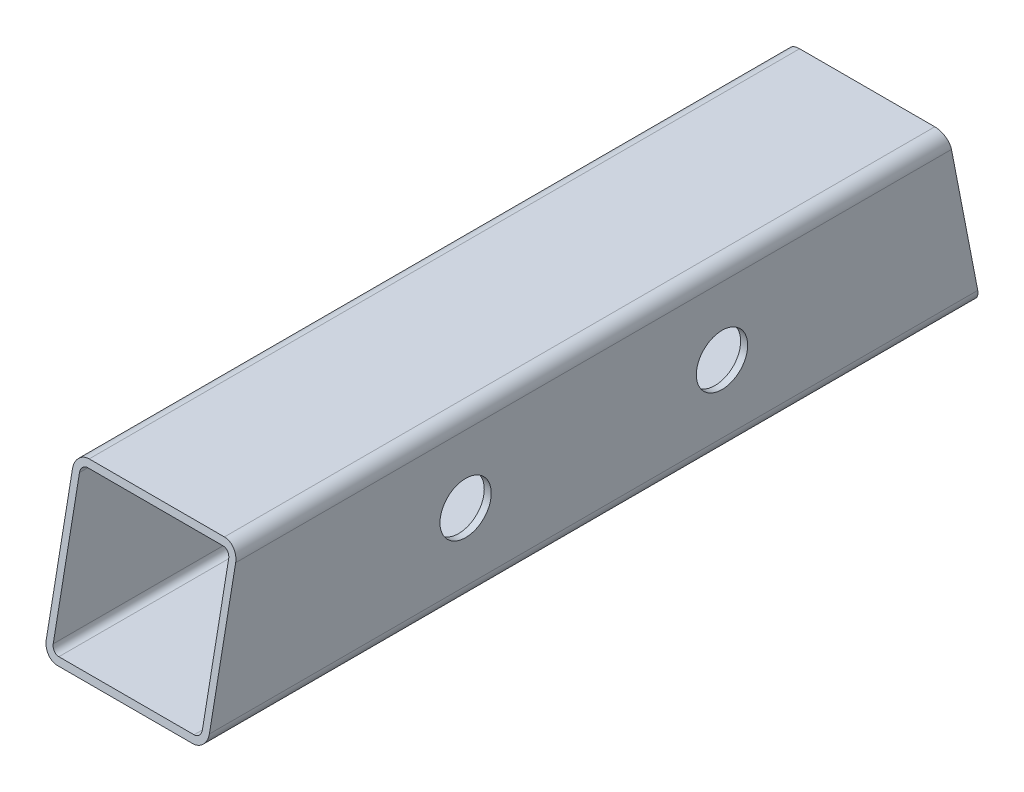
ISO-10303-21;
HEADER;
FILE_DESCRIPTION(('STEP AP214'),'2;1');
FILE_NAME('part.step','',(''),(''),'','','');
FILE_SCHEMA(('AUTOMOTIVE_DESIGN { 1 0 10303 214 1 1 1 1 }'));
ENDSEC;
DATA;
#1=APPLICATION_CONTEXT('core data for automotive mechanical design processes');
#2=APPLICATION_PROTOCOL_DEFINITION('international standard','automotive_design',2000,#1);
#3=PRODUCT_CONTEXT('',#1,'mechanical');
#4=PRODUCT('Part','Part','',(#3));
#5=PRODUCT_RELATED_PRODUCT_CATEGORY('part','',(#4));
#6=PRODUCT_DEFINITION_FORMATION('','',#4);
#7=PRODUCT_DEFINITION_CONTEXT('part definition',#1,'design');
#8=PRODUCT_DEFINITION('design','',#6,#7);
#9=PRODUCT_DEFINITION_SHAPE('','',#8);
#10=(LENGTH_UNIT() NAMED_UNIT(*) SI_UNIT(.MILLI.,.METRE.));
#11=(NAMED_UNIT(*) PLANE_ANGLE_UNIT() SI_UNIT($,.RADIAN.));
#12=(NAMED_UNIT(*) SI_UNIT($,.STERADIAN.) SOLID_ANGLE_UNIT());
#13=UNCERTAINTY_MEASURE_WITH_UNIT(LENGTH_MEASURE(1.E-05),#10,'distance_accuracy_value','');
#14=(GEOMETRIC_REPRESENTATION_CONTEXT(3) GLOBAL_UNCERTAINTY_ASSIGNED_CONTEXT((#13)) GLOBAL_UNIT_ASSIGNED_CONTEXT((#10,
#11,#12)) REPRESENTATION_CONTEXT('',''));
#15=CARTESIAN_POINT('',(0.,0.,0.));
#16=DIRECTION('',(0.,0.,1.));
#17=DIRECTION('',(1.,0.,0.));
#18=AXIS2_PLACEMENT_3D('',#15,#16,#17);
#19=CARTESIAN_POINT('',(22.4792899408284,23.5118343195266,332.));
#20=DIRECTION('',(0.,0.,-1.));
#21=DIRECTION('',(-1.,0.,0.));
#22=AXIS2_PLACEMENT_3D('',#19,#20,#21);
#23=CYLINDRICAL_SURFACE('',#22,6.);
#24=CARTESIAN_POINT('',(22.4792899408284,23.5118343195266,319.565714285714));
#25=DIRECTION('',(0.,0.190719516860693,0.981644572077096));
#26=DIRECTION('',(0.,0.981644572077096,-0.190719516860693));
#27=AXIS2_PLACEMENT_3D('',#24,#25,#26);
#28=ELLIPSE('',#27,6.11219189783161,6.);
#29=CARTESIAN_POINT('',(28.4792899408284,23.5118343195266,319.565714285714));
#30=VERTEX_POINT('',#29);
#31=CARTESIAN_POINT('',(22.4792899408284,29.5118343195266,318.4));
#32=VERTEX_POINT('',#31);
#33=EDGE_CURVE('E196',#30,#32,#28,.T.);
#34=ORIENTED_EDGE('',*,*,#33,.F.);
#35=DIRECTION('',(0.,0.,-1.));
#36=VECTOR('',#35,1.);
#37=CARTESIAN_POINT('',(28.4792899408284,23.5118343195266,332.));
#38=LINE('',#37,#36);
#39=CARTESIAN_POINT('',(28.4792899408284,23.5118343195266,12.4342857142857));
#40=VERTEX_POINT('',#39);
#41=EDGE_CURVE('E100',#30,#40,#38,.T.);
#42=ORIENTED_EDGE('',*,*,#41,.T.);
#43=CARTESIAN_POINT('',(22.4792899408284,23.5118343195266,12.4342857142857));
#44=DIRECTION('',(0.,0.190719516860693,-0.981644572077096));
#45=DIRECTION('',(0.,-0.981644572077096,-0.190719516860693));
#46=AXIS2_PLACEMENT_3D('',#43,#44,#45);
#47=ELLIPSE('',#46,6.11219189783161,6.);
#48=CARTESIAN_POINT('',(22.4792899408284,29.5118343195266,13.6));
#49=VERTEX_POINT('',#48);
#50=EDGE_CURVE('E309',#49,#40,#47,.T.);
#51=ORIENTED_EDGE('',*,*,#50,.F.);
#52=DIRECTION('',(0.,0.,-1.));
#53=VECTOR('',#52,1.);
#54=CARTESIAN_POINT('',(22.4792899408284,29.5118343195266,332.));
#55=LINE('',#54,#53);
#56=EDGE_CURVE('E84',#32,#49,#55,.T.);
#57=ORIENTED_EDGE('',*,*,#56,.F.);
#58=EDGE_LOOP('',(#34,#42,#51,#57));
#59=FACE_BOUND('',#58,.T.);
#60=ADVANCED_FACE('F76',(#59),#23,.T.);
#61=CARTESIAN_POINT('',(22.4792899408284,29.5118343195266,332.));
#62=DIRECTION('',(0.,-1.,0.));
#63=DIRECTION('',(1.,0.,0.));
#64=AXIS2_PLACEMENT_3D('',#61,#62,#63);
#65=PLANE('',#64);
#66=DIRECTION('',(1.,0.,0.));
#67=VECTOR('',#66,1.);
#68=CARTESIAN_POINT('',(-301.520710059172,29.5118343195266,318.4));
#69=LINE('',#68,#67);
#70=CARTESIAN_POINT('',(-35.5207100591716,29.5118343195266,318.4));
#71=VERTEX_POINT('',#70);
#72=EDGE_CURVE('E191',#71,#32,#69,.T.);
#73=ORIENTED_EDGE('',*,*,#72,.T.);
#74=ORIENTED_EDGE('',*,*,#56,.T.);
#75=DIRECTION('',(1.,0.,0.));
#76=VECTOR('',#75,1.);
#77=CARTESIAN_POINT('',(-301.520710059172,29.5118343195266,13.6));
#78=LINE('',#77,#76);
#79=CARTESIAN_POINT('',(-35.5207100591716,29.5118343195266,13.6));
#80=VERTEX_POINT('',#79);
#81=EDGE_CURVE('E215',#80,#49,#78,.T.);
#82=ORIENTED_EDGE('',*,*,#81,.F.);
#83=DIRECTION('',(0.,0.,-1.));
#84=VECTOR('',#83,1.);
#85=CARTESIAN_POINT('',(-35.5207100591716,29.5118343195266,332.));
#86=LINE('',#85,#84);
#87=EDGE_CURVE('E207',#71,#80,#86,.T.);
#88=ORIENTED_EDGE('',*,*,#87,.F.);
#89=EDGE_LOOP('',(#73,#74,#82,#88));
#90=FACE_BOUND('',#89,.T.);
#91=ADVANCED_FACE('F213',(#90),#65,.F.);
#92=CARTESIAN_POINT('',(-35.5207100591716,23.5118343195266,332.));
#93=DIRECTION('',(0.,0.,-1.));
#94=DIRECTION('',(-1.,0.,0.));
#95=AXIS2_PLACEMENT_3D('',#92,#93,#94);
#96=CYLINDRICAL_SURFACE('',#95,6.);
#97=CARTESIAN_POINT('',(-35.5207100591716,23.5118343195266,319.565714285714));
#98=DIRECTION('',(0.,0.190719516860693,0.981644572077096));
#99=DIRECTION('',(0.,0.981644572077096,-0.190719516860693));
#100=AXIS2_PLACEMENT_3D('',#97,#98,#99);
#101=ELLIPSE('',#100,6.11219189783161,6.);
#102=CARTESIAN_POINT('',(-41.5207100591716,23.5118343195266,319.565714285714));
#103=VERTEX_POINT('',#102);
#104=EDGE_CURVE('E194',#71,#103,#101,.T.);
#105=ORIENTED_EDGE('',*,*,#104,.F.);
#106=ORIENTED_EDGE('',*,*,#87,.T.);
#107=CARTESIAN_POINT('',(-35.5207100591716,23.5118343195266,12.4342857142857));
#108=DIRECTION('',(0.,0.190719516860693,-0.981644572077096));
#109=DIRECTION('',(0.,-0.981644572077096,-0.190719516860693));
#110=AXIS2_PLACEMENT_3D('',#107,#108,#109);
#111=ELLIPSE('',#110,6.11219189783161,6.);
#112=CARTESIAN_POINT('',(-41.5207100591716,23.5118343195266,12.4342857142857));
#113=VERTEX_POINT('',#112);
#114=EDGE_CURVE('E307',#113,#80,#111,.T.);
#115=ORIENTED_EDGE('',*,*,#114,.F.);
#116=DIRECTION('',(0.,0.,-1.));
#117=VECTOR('',#116,1.);
#118=CARTESIAN_POINT('',(-41.5207100591716,23.5118343195266,332.));
#119=LINE('',#118,#117);
#120=EDGE_CURVE('E209',#103,#113,#119,.T.);
#121=ORIENTED_EDGE('',*,*,#120,.F.);
#122=EDGE_LOOP('',(#105,#106,#115,#121));
#123=FACE_BOUND('',#122,.T.);
#124=ADVANCED_FACE('F205',(#123),#96,.T.);
#125=CARTESIAN_POINT('',(-41.5207100591716,23.5118343195266,332.));
#126=DIRECTION('',(1.,0.,0.));
#127=DIRECTION('',(0.,1.,0.));
#128=AXIS2_PLACEMENT_3D('',#125,#126,#127);
#129=PLANE('',#128);
#130=CARTESIAN_POINT('',(-41.5207100591716,-5.48816568047335,110.9));
#131=DIRECTION('',(1.,0.,0.));
#132=DIRECTION('',(0.,1.,0.));
#133=AXIS2_PLACEMENT_3D('',#130,#131,#132);
#134=CIRCLE('',#133,7.5);
#135=CARTESIAN_POINT('',(-41.5207100591716,2.01183431952665,110.9));
#136=VERTEX_POINT('',#135);
#137=EDGE_CURVE('E271',#136,#136,#134,.T.);
#138=ORIENTED_EDGE('',*,*,#137,.T.);
#139=EDGE_LOOP('',(#138));
#140=FACE_BOUND('',#139,.T.);
#141=CARTESIAN_POINT('',(-41.5207100591716,-5.48816568047337,220.9));
#142=DIRECTION('',(1.,0.,0.));
#143=DIRECTION('',(0.,1.,0.));
#144=AXIS2_PLACEMENT_3D('',#141,#142,#143);
#145=CIRCLE('',#144,7.50000000000001);
#146=CARTESIAN_POINT('',(-41.5207100591716,2.01183431952664,220.9));
#147=VERTEX_POINT('',#146);
#148=EDGE_CURVE('E265',#147,#147,#145,.T.);
#149=ORIENTED_EDGE('',*,*,#148,.T.);
#150=EDGE_LOOP('',(#149));
#151=FACE_BOUND('',#150,.T.);
#152=DIRECTION('',(0.,-0.981644572077096,0.190719516860693));
#153=VECTOR('',#152,1.);
#154=CARTESIAN_POINT('',(-41.5207100591716,21.1839025363857,320.01799817501));
#155=LINE('',#154,#153);
#156=CARTESIAN_POINT('',(-41.5207100591716,-34.4881656804733,330.834285714286));
#157=VERTEX_POINT('',#156);
#158=EDGE_CURVE('E210',#103,#157,#155,.T.);
#159=ORIENTED_EDGE('',*,*,#158,.F.);
#160=ORIENTED_EDGE('',*,*,#120,.T.);
#161=DIRECTION('',(0.,0.981644572077096,0.190719516860693));
#162=VECTOR('',#161,1.);
#163=CARTESIAN_POINT('',(-41.5207100591716,83.3405370035202,24.058147950033));
#164=LINE('',#163,#162);
#165=CARTESIAN_POINT('',(-41.5207100591716,-34.4881656804733,1.16571428571427));
#166=VERTEX_POINT('',#165);
#167=EDGE_CURVE('E304',#166,#113,#164,.T.);
#168=ORIENTED_EDGE('',*,*,#167,.F.);
#169=DIRECTION('',(0.,0.,-1.));
#170=VECTOR('',#169,1.);
#171=CARTESIAN_POINT('',(-41.5207100591716,-34.4881656804733,332.));
#172=LINE('',#171,#170);
#173=EDGE_CURVE('E218',#157,#166,#172,.T.);
#174=ORIENTED_EDGE('',*,*,#173,.F.);
#175=EDGE_LOOP('',(#159,#160,#168,#174));
#176=FACE_BOUND('',#175,.T.);
#177=ADVANCED_FACE('F350',(#140,#151,#176),#129,.F.);
#178=CARTESIAN_POINT('',(-35.5207100591716,-34.4881656804734,332.));
#179=DIRECTION('',(0.,0.,-1.));
#180=DIRECTION('',(-1.,0.,0.));
#181=AXIS2_PLACEMENT_3D('',#178,#179,#180);
#182=CYLINDRICAL_SURFACE('',#181,6.);
#183=CARTESIAN_POINT('',(-35.5207100591716,-34.4881656804734,330.834285714286));
#184=DIRECTION('',(0.,0.190719516860693,0.981644572077096));
#185=DIRECTION('',(0.,0.981644572077096,-0.190719516860693));
#186=AXIS2_PLACEMENT_3D('',#183,#184,#185);
#187=ELLIPSE('',#186,6.11219189783161,6.);
#188=CARTESIAN_POINT('',(-35.5207100591715,-40.4881656804734,332.));
#189=VERTEX_POINT('',#188);
#190=EDGE_CURVE('E258',#157,#189,#187,.T.);
#191=ORIENTED_EDGE('',*,*,#190,.F.);
#192=ORIENTED_EDGE('',*,*,#173,.T.);
#193=CARTESIAN_POINT('',(-35.5207100591716,-34.4881656804734,1.16571428571427));
#194=DIRECTION('',(0.,0.190719516860693,-0.981644572077096));
#195=DIRECTION('',(0.,-0.981644572077096,-0.190719516860693));
#196=AXIS2_PLACEMENT_3D('',#193,#194,#195);
#197=ELLIPSE('',#196,6.11219189783161,6.);
#198=CARTESIAN_POINT('',(-35.5207100591716,-40.4881656804734,0.));
#199=VERTEX_POINT('',#198);
#200=EDGE_CURVE('E301',#199,#166,#197,.T.);
#201=ORIENTED_EDGE('',*,*,#200,.F.);
#202=DIRECTION('',(0.,0.,-1.));
#203=VECTOR('',#202,1.);
#204=CARTESIAN_POINT('',(-35.5207100591715,-40.4881656804734,332.));
#205=LINE('',#204,#203);
#206=EDGE_CURVE('E338',#189,#199,#205,.T.);
#207=ORIENTED_EDGE('',*,*,#206,.F.);
#208=EDGE_LOOP('',(#191,#192,#201,#207));
#209=FACE_BOUND('',#208,.T.);
#210=ADVANCED_FACE('F344',(#209),#182,.T.);
#211=CARTESIAN_POINT('',(22.4792899408284,-34.4881656804734,332.));
#212=DIRECTION('',(0.,0.,-1.));
#213=DIRECTION('',(-1.,0.,0.));
#214=AXIS2_PLACEMENT_3D('',#211,#212,#213);
#215=CYLINDRICAL_SURFACE('',#214,6.);
#216=CARTESIAN_POINT('',(22.4792899408284,-34.4881656804734,330.834285714286));
#217=DIRECTION('',(0.,0.190719516860693,0.981644572077096));
#218=DIRECTION('',(0.,0.981644572077096,-0.190719516860693));
#219=AXIS2_PLACEMENT_3D('',#216,#217,#218);
#220=ELLIPSE('',#219,6.11219189783161,6.);
#221=CARTESIAN_POINT('',(22.4792899408284,-40.4881656804734,332.));
#222=VERTEX_POINT('',#221);
#223=CARTESIAN_POINT('',(28.4792899408284,-34.4881656804734,330.834285714286));
#224=VERTEX_POINT('',#223);
#225=EDGE_CURVE('E256',#222,#224,#220,.T.);
#226=ORIENTED_EDGE('',*,*,#225,.F.);
#227=DIRECTION('',(0.,0.,-1.));
#228=VECTOR('',#227,1.);
#229=CARTESIAN_POINT('',(22.4792899408284,-40.4881656804734,332.));
#230=LINE('',#229,#228);
#231=CARTESIAN_POINT('',(22.4792899408284,-40.4881656804734,0.));
#232=VERTEX_POINT('',#231);
#233=EDGE_CURVE('E335',#222,#232,#230,.T.);
#234=ORIENTED_EDGE('',*,*,#233,.T.);
#235=CARTESIAN_POINT('',(22.4792899408284,-34.4881656804734,1.16571428571427));
#236=DIRECTION('',(0.,0.190719516860693,-0.981644572077096));
#237=DIRECTION('',(0.,-0.981644572077096,-0.190719516860693));
#238=AXIS2_PLACEMENT_3D('',#235,#236,#237);
#239=ELLIPSE('',#238,6.11219189783161,6.);
#240=CARTESIAN_POINT('',(28.4792899408284,-34.4881656804733,1.16571428571429));
#241=VERTEX_POINT('',#240);
#242=EDGE_CURVE('E299',#241,#232,#239,.T.);
#243=ORIENTED_EDGE('',*,*,#242,.F.);
#244=DIRECTION('',(0.,0.,-1.));
#245=VECTOR('',#244,1.);
#246=CARTESIAN_POINT('',(28.4792899408284,-34.4881656804733,332.));
#247=LINE('',#246,#245);
#248=EDGE_CURVE('E333',#224,#241,#247,.T.);
#249=ORIENTED_EDGE('',*,*,#248,.F.);
#250=EDGE_LOOP('',(#226,#234,#243,#249));
#251=FACE_BOUND('',#250,.T.);
#252=ADVANCED_FACE('F358',(#251),#215,.T.);
#253=CARTESIAN_POINT('',(28.4792899408284,23.5118343195266,332.));
#254=DIRECTION('',(-1.,0.,0.));
#255=DIRECTION('',(0.,-1.,0.));
#256=AXIS2_PLACEMENT_3D('',#253,#254,#255);
#257=PLANE('',#256);
#258=CARTESIAN_POINT('',(28.4792899408284,-5.48816568047334,110.9));
#259=DIRECTION('',(1.,0.,0.));
#260=DIRECTION('',(0.,1.,0.));
#261=AXIS2_PLACEMENT_3D('',#258,#259,#260);
#262=CIRCLE('',#261,11.);
#263=CARTESIAN_POINT('',(28.4792899408284,5.51183431952665,110.9));
#264=VERTEX_POINT('',#263);
#265=EDGE_CURVE('E230',#264,#264,#262,.T.);
#266=ORIENTED_EDGE('',*,*,#265,.F.);
#267=EDGE_LOOP('',(#266));
#268=FACE_BOUND('',#267,.T.);
#269=CARTESIAN_POINT('',(28.4792899408284,-5.48816568047337,220.9));
#270=DIRECTION('',(1.,0.,0.));
#271=DIRECTION('',(0.,1.,0.));
#272=AXIS2_PLACEMENT_3D('',#269,#270,#271);
#273=CIRCLE('',#272,11.);
#274=CARTESIAN_POINT('',(28.4792899408284,5.51183431952664,220.9));
#275=VERTEX_POINT('',#274);
#276=EDGE_CURVE('E222',#275,#275,#273,.T.);
#277=ORIENTED_EDGE('',*,*,#276,.F.);
#278=EDGE_LOOP('',(#277));
#279=FACE_BOUND('',#278,.T.);
#280=DIRECTION('',(0.,-0.981644572077096,0.190719516860693));
#281=VECTOR('',#280,1.);
#282=CARTESIAN_POINT('',(28.4792899408284,29.5118343195266,318.4));
#283=LINE('',#282,#281);
#284=EDGE_CURVE('E200',#30,#224,#283,.T.);
#285=ORIENTED_EDGE('',*,*,#284,.T.);
#286=ORIENTED_EDGE('',*,*,#248,.T.);
#287=DIRECTION('',(0.,0.981644572077096,0.190719516860693));
#288=VECTOR('',#287,1.);
#289=CARTESIAN_POINT('',(28.4792899408284,-1.47271387076011,7.58014492303));
#290=LINE('',#289,#288);
#291=EDGE_CURVE('E274',#241,#40,#290,.T.);
#292=ORIENTED_EDGE('',*,*,#291,.T.);
#293=ORIENTED_EDGE('',*,*,#41,.F.);
#294=EDGE_LOOP('',(#285,#286,#292,#293));
#295=FACE_BOUND('',#294,.T.);
#296=ADVANCED_FACE('F361',(#268,#279,#295),#257,.F.);
#297=CARTESIAN_POINT('',(22.4792899408284,23.5118343195266,332.));
#298=DIRECTION('',(0.,0.,-1.));
#299=DIRECTION('',(-1.,0.,0.));
#300=AXIS2_PLACEMENT_3D('',#297,#298,#299);
#301=CYLINDRICAL_SURFACE('',#300,3.);
#302=DIRECTION('',(0.,0.,-1.));
#303=VECTOR('',#302,1.);
#304=CARTESIAN_POINT('',(25.4792899408284,23.5118343195266,332.));
#305=LINE('',#304,#303);
#306=CARTESIAN_POINT('',(25.4792899408284,23.5118343195266,319.565714285714));
#307=VERTEX_POINT('',#306);
#308=CARTESIAN_POINT('',(25.4792899408284,23.5118343195266,12.4342857142857));
#309=VERTEX_POINT('',#308);
#310=EDGE_CURVE('E311',#307,#309,#305,.T.);
#311=ORIENTED_EDGE('',*,*,#310,.F.);
#312=CARTESIAN_POINT('',(22.4792899408284,23.5118343195266,319.565714285714));
#313=DIRECTION('',(0.,0.190719516860693,0.981644572077096));
#314=DIRECTION('',(0.,0.981644572077096,-0.190719516860693));
#315=AXIS2_PLACEMENT_3D('',#312,#313,#314);
#316=ELLIPSE('',#315,3.0560959489158,3.);
#317=CARTESIAN_POINT('',(22.4792899408284,26.5118343195266,318.982857142857));
#318=VERTEX_POINT('',#317);
#319=EDGE_CURVE('E92',#307,#318,#316,.T.);
#320=ORIENTED_EDGE('',*,*,#319,.T.);
#321=DIRECTION('',(0.,0.,-1.));
#322=VECTOR('',#321,1.);
#323=CARTESIAN_POINT('',(22.4792899408284,26.5118343195266,332.));
#324=LINE('',#323,#322);
#325=CARTESIAN_POINT('',(22.4792899408284,26.5118343195266,13.0171428571428));
#326=VERTEX_POINT('',#325);
#327=EDGE_CURVE('E325',#318,#326,#324,.T.);
#328=ORIENTED_EDGE('',*,*,#327,.T.);
#329=CARTESIAN_POINT('',(22.4792899408284,23.5118343195266,12.4342857142857));
#330=DIRECTION('',(0.,0.190719516860693,-0.981644572077096));
#331=DIRECTION('',(0.,-0.981644572077096,-0.190719516860693));
#332=AXIS2_PLACEMENT_3D('',#329,#330,#331);
#333=ELLIPSE('',#332,3.0560959489158,3.);
#334=EDGE_CURVE('E296',#326,#309,#333,.T.);
#335=ORIENTED_EDGE('',*,*,#334,.T.);
#336=EDGE_LOOP('',(#311,#320,#328,#335));
#337=FACE_BOUND('',#336,.T.);
#338=ADVANCED_FACE('F384',(#337),#301,.F.);
#339=CARTESIAN_POINT('',(22.4792899408284,26.5118343195266,332.));
#340=DIRECTION('',(0.,-1.,0.));
#341=DIRECTION('',(1.,0.,0.));
#342=AXIS2_PLACEMENT_3D('',#339,#340,#341);
#343=PLANE('',#342);
#344=ORIENTED_EDGE('',*,*,#327,.F.);
#345=DIRECTION('',(-1.,0.,0.));
#346=VECTOR('',#345,1.);
#347=CARTESIAN_POINT('',(22.4792899408284,26.5118343195266,318.982857142857));
#348=LINE('',#347,#346);
#349=CARTESIAN_POINT('',(-35.5207100591716,26.5118343195266,318.982857142857));
#350=VERTEX_POINT('',#349);
#351=EDGE_CURVE('E252',#318,#350,#348,.T.);
#352=ORIENTED_EDGE('',*,*,#351,.T.);
#353=DIRECTION('',(0.,0.,-1.));
#354=VECTOR('',#353,1.);
#355=CARTESIAN_POINT('',(-35.5207100591716,26.5118343195266,332.));
#356=LINE('',#355,#354);
#357=CARTESIAN_POINT('',(-35.5207100591716,26.5118343195266,13.0171428571428));
#358=VERTEX_POINT('',#357);
#359=EDGE_CURVE('E323',#350,#358,#356,.T.);
#360=ORIENTED_EDGE('',*,*,#359,.T.);
#361=DIRECTION('',(1.,0.,0.));
#362=VECTOR('',#361,1.);
#363=CARTESIAN_POINT('',(22.4792899408284,26.5118343195266,13.0171428571428));
#364=LINE('',#363,#362);
#365=EDGE_CURVE('E293',#358,#326,#364,.T.);
#366=ORIENTED_EDGE('',*,*,#365,.T.);
#367=EDGE_LOOP('',(#344,#352,#360,#366));
#368=FACE_BOUND('',#367,.T.);
#369=ADVANCED_FACE('F388',(#368),#343,.T.);
#370=CARTESIAN_POINT('',(-35.5207100591716,23.5118343195266,332.));
#371=DIRECTION('',(0.,0.,-1.));
#372=DIRECTION('',(-1.,0.,0.));
#373=AXIS2_PLACEMENT_3D('',#370,#371,#372);
#374=CYLINDRICAL_SURFACE('',#373,3.);
#375=ORIENTED_EDGE('',*,*,#359,.F.);
#376=CARTESIAN_POINT('',(-35.5207100591716,23.5118343195266,319.565714285714));
#377=DIRECTION('',(0.,0.190719516860693,0.981644572077096));
#378=DIRECTION('',(0.,0.981644572077096,-0.190719516860693));
#379=AXIS2_PLACEMENT_3D('',#376,#377,#378);
#380=ELLIPSE('',#379,3.05609594891581,3.);
#381=CARTESIAN_POINT('',(-38.5207100591716,23.5118343195266,319.565714285714));
#382=VERTEX_POINT('',#381);
#383=EDGE_CURVE('E249',#350,#382,#380,.T.);
#384=ORIENTED_EDGE('',*,*,#383,.T.);
#385=DIRECTION('',(0.,0.,-1.));
#386=VECTOR('',#385,1.);
#387=CARTESIAN_POINT('',(-38.5207100591716,23.5118343195266,332.));
#388=LINE('',#387,#386);
#389=CARTESIAN_POINT('',(-38.5207100591716,23.5118343195266,12.4342857142857));
#390=VERTEX_POINT('',#389);
#391=EDGE_CURVE('E321',#382,#390,#388,.T.);
#392=ORIENTED_EDGE('',*,*,#391,.T.);
#393=CARTESIAN_POINT('',(-35.5207100591716,23.5118343195266,12.4342857142857));
#394=DIRECTION('',(0.,0.190719516860693,-0.981644572077096));
#395=DIRECTION('',(0.,-0.981644572077096,-0.190719516860693));
#396=AXIS2_PLACEMENT_3D('',#393,#394,#395);
#397=ELLIPSE('',#396,3.05609594891581,3.);
#398=EDGE_CURVE('E290',#390,#358,#397,.T.);
#399=ORIENTED_EDGE('',*,*,#398,.T.);
#400=EDGE_LOOP('',(#375,#384,#392,#399));
#401=FACE_BOUND('',#400,.T.);
#402=ADVANCED_FACE('F392',(#401),#374,.F.);
#403=CARTESIAN_POINT('',(-38.5207100591716,23.5118343195266,332.));
#404=DIRECTION('',(1.,0.,0.));
#405=DIRECTION('',(0.,1.,0.));
#406=AXIS2_PLACEMENT_3D('',#403,#404,#405);
#407=PLANE('',#406);
#408=CARTESIAN_POINT('',(-38.5207100591716,-5.48816568047335,110.9));
#409=DIRECTION('',(1.,0.,0.));
#410=DIRECTION('',(0.,1.,0.));
#411=AXIS2_PLACEMENT_3D('',#408,#409,#410);
#412=CIRCLE('',#411,7.5);
#413=CARTESIAN_POINT('',(-38.5207100591716,2.01183431952665,110.9));
#414=VERTEX_POINT('',#413);
#415=EDGE_CURVE('E268',#414,#414,#412,.T.);
#416=ORIENTED_EDGE('',*,*,#415,.F.);
#417=EDGE_LOOP('',(#416));
#418=FACE_BOUND('',#417,.T.);
#419=CARTESIAN_POINT('',(-38.5207100591716,-5.48816568047337,220.9));
#420=DIRECTION('',(1.,0.,0.));
#421=DIRECTION('',(0.,1.,0.));
#422=AXIS2_PLACEMENT_3D('',#419,#420,#421);
#423=CIRCLE('',#422,7.50000000000001);
#424=CARTESIAN_POINT('',(-38.5207100591716,2.01183431952664,220.9));
#425=VERTEX_POINT('',#424);
#426=EDGE_CURVE('E262',#425,#425,#423,.T.);
#427=ORIENTED_EDGE('',*,*,#426,.F.);
#428=EDGE_LOOP('',(#427));
#429=FACE_BOUND('',#428,.T.);
#430=ORIENTED_EDGE('',*,*,#391,.F.);
#431=DIRECTION('',(0.,-0.981644572077096,0.190719516860693));
#432=VECTOR('',#431,1.);
#433=CARTESIAN_POINT('',(-38.5207100591716,21.1839025363857,320.01799817501));
#434=LINE('',#433,#432);
#435=CARTESIAN_POINT('',(-38.5207100591716,-34.4881656804733,330.834285714286));
#436=VERTEX_POINT('',#435);
#437=EDGE_CURVE('E246',#382,#436,#434,.T.);
#438=ORIENTED_EDGE('',*,*,#437,.T.);
#439=DIRECTION('',(0.,0.,-1.));
#440=VECTOR('',#439,1.);
#441=CARTESIAN_POINT('',(-38.5207100591716,-34.4881656804733,332.));
#442=LINE('',#441,#440);
#443=CARTESIAN_POINT('',(-38.5207100591716,-34.4881656804733,1.16571428571427));
#444=VERTEX_POINT('',#443);
#445=EDGE_CURVE('E319',#436,#444,#442,.T.);
#446=ORIENTED_EDGE('',*,*,#445,.T.);
#447=DIRECTION('',(0.,0.981644572077096,0.190719516860693));
#448=VECTOR('',#447,1.);
#449=CARTESIAN_POINT('',(-38.5207100591716,83.3405370035202,24.058147950033));
#450=LINE('',#449,#448);
#451=EDGE_CURVE('E287',#444,#390,#450,.T.);
#452=ORIENTED_EDGE('',*,*,#451,.T.);
#453=EDGE_LOOP('',(#430,#438,#446,#452));
#454=FACE_BOUND('',#453,.T.);
#455=ADVANCED_FACE('F396',(#418,#429,#454),#407,.T.);
#456=CARTESIAN_POINT('',(-35.5207100591716,-34.4881656804734,332.));
#457=DIRECTION('',(0.,0.,-1.));
#458=DIRECTION('',(-1.,0.,0.));
#459=AXIS2_PLACEMENT_3D('',#456,#457,#458);
#460=CYLINDRICAL_SURFACE('',#459,3.);
#461=ORIENTED_EDGE('',*,*,#445,.F.);
#462=CARTESIAN_POINT('',(-35.5207100591716,-34.4881656804734,330.834285714286));
#463=DIRECTION('',(0.,0.190719516860693,0.981644572077096));
#464=DIRECTION('',(0.,0.981644572077096,-0.190719516860693));
#465=AXIS2_PLACEMENT_3D('',#462,#463,#464);
#466=ELLIPSE('',#465,3.0560959489158,3.);
#467=CARTESIAN_POINT('',(-35.5207100591716,-37.4881656804734,331.417142857143));
#468=VERTEX_POINT('',#467);
#469=EDGE_CURVE('E243',#436,#468,#466,.T.);
#470=ORIENTED_EDGE('',*,*,#469,.T.);
#471=DIRECTION('',(0.,0.,-1.));
#472=VECTOR('',#471,1.);
#473=CARTESIAN_POINT('',(-35.5207100591716,-37.4881656804734,332.));
#474=LINE('',#473,#472);
#475=CARTESIAN_POINT('',(-35.5207100591716,-37.4881656804734,0.582857142857107));
#476=VERTEX_POINT('',#475);
#477=EDGE_CURVE('E317',#468,#476,#474,.T.);
#478=ORIENTED_EDGE('',*,*,#477,.T.);
#479=CARTESIAN_POINT('',(-35.5207100591716,-34.4881656804734,1.16571428571427));
#480=DIRECTION('',(0.,0.190719516860693,-0.981644572077096));
#481=DIRECTION('',(0.,-0.981644572077096,-0.190719516860693));
#482=AXIS2_PLACEMENT_3D('',#479,#480,#481);
#483=ELLIPSE('',#482,3.0560959489158,3.);
#484=EDGE_CURVE('E284',#476,#444,#483,.T.);
#485=ORIENTED_EDGE('',*,*,#484,.T.);
#486=EDGE_LOOP('',(#461,#470,#478,#485));
#487=FACE_BOUND('',#486,.T.);
#488=ADVANCED_FACE('F400',(#487),#460,.F.);
#489=CARTESIAN_POINT('',(22.4792899408284,-37.4881656804734,332.));
#490=DIRECTION('',(0.,1.,0.));
#491=DIRECTION('',(-1.,0.,0.));
#492=AXIS2_PLACEMENT_3D('',#489,#490,#491);
#493=PLANE('',#492);
#494=ORIENTED_EDGE('',*,*,#477,.F.);
#495=DIRECTION('',(1.,0.,0.));
#496=VECTOR('',#495,1.);
#497=CARTESIAN_POINT('',(22.4792899408284,-37.4881656804734,331.417142857143));
#498=LINE('',#497,#496);
#499=CARTESIAN_POINT('',(22.4792899408284,-37.4881656804734,331.417142857143));
#500=VERTEX_POINT('',#499);
#501=EDGE_CURVE('E240',#468,#500,#498,.T.);
#502=ORIENTED_EDGE('',*,*,#501,.T.);
#503=DIRECTION('',(0.,0.,-1.));
#504=VECTOR('',#503,1.);
#505=CARTESIAN_POINT('',(22.4792899408284,-37.4881656804734,332.));
#506=LINE('',#505,#504);
#507=CARTESIAN_POINT('',(22.4792899408284,-37.4881656804734,0.582857142857107));
#508=VERTEX_POINT('',#507);
#509=EDGE_CURVE('E315',#500,#508,#506,.T.);
#510=ORIENTED_EDGE('',*,*,#509,.T.);
#511=DIRECTION('',(-1.,0.,0.));
#512=VECTOR('',#511,1.);
#513=CARTESIAN_POINT('',(22.4792899408284,-37.4881656804734,0.582857142857107));
#514=LINE('',#513,#512);
#515=EDGE_CURVE('E281',#508,#476,#514,.T.);
#516=ORIENTED_EDGE('',*,*,#515,.T.);
#517=EDGE_LOOP('',(#494,#502,#510,#516));
#518=FACE_BOUND('',#517,.T.);
#519=ADVANCED_FACE('F404',(#518),#493,.T.);
#520=CARTESIAN_POINT('',(22.4792899408284,-34.4881656804734,332.));
#521=DIRECTION('',(0.,0.,-1.));
#522=DIRECTION('',(-1.,0.,0.));
#523=AXIS2_PLACEMENT_3D('',#520,#521,#522);
#524=CYLINDRICAL_SURFACE('',#523,3.);
#525=ORIENTED_EDGE('',*,*,#509,.F.);
#526=CARTESIAN_POINT('',(22.4792899408284,-34.4881656804734,330.834285714286));
#527=DIRECTION('',(0.,0.190719516860693,0.981644572077096));
#528=DIRECTION('',(0.,0.981644572077096,-0.190719516860693));
#529=AXIS2_PLACEMENT_3D('',#526,#527,#528);
#530=ELLIPSE('',#529,3.05609594891581,3.);
#531=CARTESIAN_POINT('',(25.4792899408284,-34.4881656804733,330.834285714286));
#532=VERTEX_POINT('',#531);
#533=EDGE_CURVE('E237',#500,#532,#530,.T.);
#534=ORIENTED_EDGE('',*,*,#533,.T.);
#535=DIRECTION('',(0.,0.,-1.));
#536=VECTOR('',#535,1.);
#537=CARTESIAN_POINT('',(25.4792899408284,-34.4881656804733,332.));
#538=LINE('',#537,#536);
#539=CARTESIAN_POINT('',(25.4792899408284,-34.4881656804733,1.16571428571425));
#540=VERTEX_POINT('',#539);
#541=EDGE_CURVE('E313',#532,#540,#538,.T.);
#542=ORIENTED_EDGE('',*,*,#541,.T.);
#543=CARTESIAN_POINT('',(22.4792899408284,-34.4881656804734,1.16571428571427));
#544=DIRECTION('',(0.,0.190719516860693,-0.981644572077096));
#545=DIRECTION('',(0.,-0.981644572077096,-0.190719516860693));
#546=AXIS2_PLACEMENT_3D('',#543,#544,#545);
#547=ELLIPSE('',#546,3.05609594891581,3.);
#548=EDGE_CURVE('E278',#540,#508,#547,.T.);
#549=ORIENTED_EDGE('',*,*,#548,.T.);
#550=EDGE_LOOP('',(#525,#534,#542,#549));
#551=FACE_BOUND('',#550,.T.);
#552=ADVANCED_FACE('F408',(#551),#524,.F.);
#553=CARTESIAN_POINT('',(25.4792899408284,23.5118343195266,332.));
#554=DIRECTION('',(-1.,0.,0.));
#555=DIRECTION('',(0.,-1.,0.));
#556=AXIS2_PLACEMENT_3D('',#553,#554,#555);
#557=PLANE('',#556);
#558=CARTESIAN_POINT('',(25.4792899408284,-5.48816568047334,110.9));
#559=DIRECTION('',(-1.,0.,0.));
#560=DIRECTION('',(0.,-1.,0.));
#561=AXIS2_PLACEMENT_3D('',#558,#559,#560);
#562=CIRCLE('',#561,11.);
#563=CARTESIAN_POINT('',(25.4792899408284,-16.4881656804733,110.9));
#564=VERTEX_POINT('',#563);
#565=EDGE_CURVE('E79',#564,#564,#562,.T.);
#566=ORIENTED_EDGE('',*,*,#565,.F.);
#567=EDGE_LOOP('',(#566));
#568=FACE_BOUND('',#567,.T.);
#569=CARTESIAN_POINT('',(25.4792899408284,-5.48816568047337,220.9));
#570=DIRECTION('',(-1.,0.,0.));
#571=DIRECTION('',(0.,-1.,0.));
#572=AXIS2_PLACEMENT_3D('',#569,#570,#571);
#573=CIRCLE('',#572,11.);
#574=CARTESIAN_POINT('',(25.4792899408284,-16.4881656804734,220.9));
#575=VERTEX_POINT('',#574);
#576=EDGE_CURVE('E201',#575,#575,#573,.T.);
#577=ORIENTED_EDGE('',*,*,#576,.F.);
#578=EDGE_LOOP('',(#577));
#579=FACE_BOUND('',#578,.T.);
#580=ORIENTED_EDGE('',*,*,#541,.F.);
#581=DIRECTION('',(0.,0.981644572077096,-0.190719516860693));
#582=VECTOR('',#581,1.);
#583=CARTESIAN_POINT('',(25.4792899408284,21.1839025363858,320.01799817501));
#584=LINE('',#583,#582);
#585=EDGE_CURVE('E235',#532,#307,#584,.T.);
#586=ORIENTED_EDGE('',*,*,#585,.T.);
#587=ORIENTED_EDGE('',*,*,#310,.T.);
#588=DIRECTION('',(0.,-0.981644572077096,-0.190719516860693));
#589=VECTOR('',#588,1.);
#590=CARTESIAN_POINT('',(25.4792899408284,83.3405370035202,24.058147950033));
#591=LINE('',#590,#589);
#592=EDGE_CURVE('E12',#309,#540,#591,.T.);
#593=ORIENTED_EDGE('',*,*,#592,.T.);
#594=EDGE_LOOP('',(#580,#586,#587,#593));
#595=FACE_BOUND('',#594,.T.);
#596=ADVANCED_FACE('F379',(#568,#579,#595),#557,.T.);
#597=CARTESIAN_POINT('',(22.4792899408284,-40.4881656804734,332.));
#598=DIRECTION('',(0.,1.,0.));
#599=DIRECTION('',(-1.,0.,0.));
#600=AXIS2_PLACEMENT_3D('',#597,#598,#599);
#601=PLANE('',#600);
#602=DIRECTION('',(1.,0.,0.));
#603=VECTOR('',#602,1.);
#604=CARTESIAN_POINT('',(22.4792899408284,-40.4881656804734,0.));
#605=LINE('',#604,#603);
#606=EDGE_CURVE('E327',#199,#232,#605,.T.);
#607=ORIENTED_EDGE('',*,*,#606,.T.);
#608=ORIENTED_EDGE('',*,*,#233,.F.);
#609=DIRECTION('',(1.,0.,0.));
#610=VECTOR('',#609,1.);
#611=CARTESIAN_POINT('',(22.4792899408284,-40.4881656804734,332.));
#612=LINE('',#611,#610);
#613=EDGE_CURVE('E328',#189,#222,#612,.T.);
#614=ORIENTED_EDGE('',*,*,#613,.F.);
#615=ORIENTED_EDGE('',*,*,#206,.T.);
#616=EDGE_LOOP('',(#607,#608,#614,#615));
#617=FACE_BOUND('',#616,.T.);
#618=ADVANCED_FACE('F355',(#617),#601,.F.);
#619=CARTESIAN_POINT('',(-301.520710059172,-1.47271387076015,7.58014492303));
#620=DIRECTION('',(0.,0.190719516860693,-0.981644572077096));
#621=DIRECTION('',(0.,0.981644572077096,0.190719516860693));
#622=AXIS2_PLACEMENT_3D('',#619,#620,#621);
#623=PLANE('',#622);
#624=ORIENTED_EDGE('',*,*,#365,.F.);
#625=ORIENTED_EDGE('',*,*,#398,.F.);
#626=ORIENTED_EDGE('',*,*,#451,.F.);
#627=ORIENTED_EDGE('',*,*,#484,.F.);
#628=ORIENTED_EDGE('',*,*,#515,.F.);
#629=ORIENTED_EDGE('',*,*,#548,.F.);
#630=ORIENTED_EDGE('',*,*,#592,.F.);
#631=ORIENTED_EDGE('',*,*,#334,.F.);
#632=EDGE_LOOP('',(#624,#625,#626,#627,#628,#629,#630,#631));
#633=FACE_BOUND('',#632,.T.);
#634=ORIENTED_EDGE('',*,*,#50,.T.);
#635=ORIENTED_EDGE('',*,*,#291,.F.);
#636=ORIENTED_EDGE('',*,*,#242,.T.);
#637=ORIENTED_EDGE('',*,*,#606,.F.);
#638=ORIENTED_EDGE('',*,*,#200,.T.);
#639=ORIENTED_EDGE('',*,*,#167,.T.);
#640=ORIENTED_EDGE('',*,*,#114,.T.);
#641=ORIENTED_EDGE('',*,*,#81,.T.);
#642=EDGE_LOOP('',(#634,#635,#636,#637,#638,#639,#640,#641));
#643=FACE_BOUND('',#642,.T.);
#644=ADVANCED_FACE('F349',(#633,#643),#623,.T.);
#645=CARTESIAN_POINT('',(-301.520710059172,60.6839205963743,312.343708951927));
#646=DIRECTION('',(0.,0.190719516860693,0.981644572077096));
#647=DIRECTION('',(0.,-0.981644572077096,0.190719516860693));
#648=AXIS2_PLACEMENT_3D('',#645,#646,#647);
#649=PLANE('',#648);
#650=ORIENTED_EDGE('',*,*,#585,.F.);
#651=ORIENTED_EDGE('',*,*,#533,.F.);
#652=ORIENTED_EDGE('',*,*,#501,.F.);
#653=ORIENTED_EDGE('',*,*,#469,.F.);
#654=ORIENTED_EDGE('',*,*,#437,.F.);
#655=ORIENTED_EDGE('',*,*,#383,.F.);
#656=ORIENTED_EDGE('',*,*,#351,.F.);
#657=ORIENTED_EDGE('',*,*,#319,.F.);
#658=EDGE_LOOP('',(#650,#651,#652,#653,#654,#655,#656,#657));
#659=FACE_BOUND('',#658,.T.);
#660=ORIENTED_EDGE('',*,*,#33,.T.);
#661=ORIENTED_EDGE('',*,*,#72,.F.);
#662=ORIENTED_EDGE('',*,*,#104,.T.);
#663=ORIENTED_EDGE('',*,*,#158,.T.);
#664=ORIENTED_EDGE('',*,*,#190,.T.);
#665=ORIENTED_EDGE('',*,*,#613,.T.);
#666=ORIENTED_EDGE('',*,*,#225,.T.);
#667=ORIENTED_EDGE('',*,*,#284,.F.);
#668=EDGE_LOOP('',(#660,#661,#662,#663,#664,#665,#666,#667));
#669=FACE_BOUND('',#668,.T.);
#670=ADVANCED_FACE('F193',(#659,#669),#649,.T.);
#671=CARTESIAN_POINT('',(-301.520710059172,-5.48816568047341,220.9));
#672=DIRECTION('',(1.,0.,0.));
#673=DIRECTION('',(0.,1.,0.));
#674=AXIS2_PLACEMENT_3D('',#671,#672,#673);
#675=CYLINDRICAL_SURFACE('',#674,7.50000000000001);
#676=CARTESIAN_POINT('',(-38.5207100591716,2.01183431952664,220.9));
#677=CARTESIAN_POINT('',(-38.5519600591716,2.01183431952664,220.9));
#678=CARTESIAN_POINT('',(-38.5832100591716,2.01183431952664,220.9));
#679=CARTESIAN_POINT('',(-38.6457100591716,2.01183431952664,220.9));
#680=CARTESIAN_POINT('',(-38.6769600591716,2.01183431952664,220.9));
#681=CARTESIAN_POINT('',(-38.7394600591716,2.01183431952664,220.9));
#682=CARTESIAN_POINT('',(-38.7707100591716,2.01183431952664,220.9));
#683=CARTESIAN_POINT('',(-38.8332100591716,2.01183431952664,220.9));
#684=CARTESIAN_POINT('',(-38.8644600591716,2.01183431952664,220.9));
#685=CARTESIAN_POINT('',(-38.9269600591716,2.01183431952664,220.9));
#686=CARTESIAN_POINT('',(-38.9582100591716,2.01183431952664,220.9));
#687=CARTESIAN_POINT('',(-39.0207100591716,2.01183431952664,220.9));
#688=CARTESIAN_POINT('',(-39.0519600591716,2.01183431952664,220.9));
#689=CARTESIAN_POINT('',(-39.1144600591716,2.01183431952664,220.9));
#690=CARTESIAN_POINT('',(-39.1457100591716,2.01183431952664,220.9));
#691=CARTESIAN_POINT('',(-39.2082100591716,2.01183431952664,220.9));
#692=CARTESIAN_POINT('',(-39.2394600591716,2.01183431952664,220.9));
#693=CARTESIAN_POINT('',(-39.3019600591716,2.01183431952664,220.9));
#694=CARTESIAN_POINT('',(-39.3332100591716,2.01183431952664,220.9));
#695=CARTESIAN_POINT('',(-39.3957100591715,2.01183431952664,220.9));
#696=CARTESIAN_POINT('',(-39.4269600591715,2.01183431952664,220.9));
#697=CARTESIAN_POINT('',(-39.4894600591716,2.01183431952664,220.9));
#698=CARTESIAN_POINT('',(-39.5207100591715,2.01183431952664,220.9));
#699=CARTESIAN_POINT('',(-39.5832100591716,2.01183431952664,220.9));
#700=CARTESIAN_POINT('',(-39.6144600591716,2.01183431952664,220.9));
#701=CARTESIAN_POINT('',(-39.6769600591716,2.01183431952664,220.9));
#702=CARTESIAN_POINT('',(-39.7082100591716,2.01183431952664,220.9));
#703=CARTESIAN_POINT('',(-39.7707100591716,2.01183431952664,220.9));
#704=CARTESIAN_POINT('',(-39.8019600591716,2.01183431952664,220.9));
#705=CARTESIAN_POINT('',(-39.8644600591716,2.01183431952664,220.9));
#706=CARTESIAN_POINT('',(-39.8957100591716,2.01183431952664,220.9));
#707=CARTESIAN_POINT('',(-39.9582100591716,2.01183431952664,220.9));
#708=CARTESIAN_POINT('',(-39.9894600591716,2.01183431952664,220.9));
#709=CARTESIAN_POINT('',(-40.0519600591716,2.01183431952664,220.9));
#710=CARTESIAN_POINT('',(-40.0832100591716,2.01183431952664,220.9));
#711=CARTESIAN_POINT('',(-40.1457100591716,2.01183431952664,220.9));
#712=CARTESIAN_POINT('',(-40.1769600591716,2.01183431952664,220.9));
#713=CARTESIAN_POINT('',(-40.2394600591716,2.01183431952664,220.9));
#714=CARTESIAN_POINT('',(-40.2707100591716,2.01183431952664,220.9));
#715=CARTESIAN_POINT('',(-40.3332100591716,2.01183431952664,220.9));
#716=CARTESIAN_POINT('',(-40.3644600591716,2.01183431952664,220.9));
#717=CARTESIAN_POINT('',(-40.4269600591716,2.01183431952664,220.9));
#718=CARTESIAN_POINT('',(-40.4582100591716,2.01183431952664,220.9));
#719=CARTESIAN_POINT('',(-40.5207100591716,2.01183431952664,220.9));
#720=CARTESIAN_POINT('',(-40.5519600591716,2.01183431952664,220.9));
#721=CARTESIAN_POINT('',(-40.6144600591716,2.01183431952664,220.9));
#722=CARTESIAN_POINT('',(-40.6457100591716,2.01183431952664,220.9));
#723=CARTESIAN_POINT('',(-40.7082100591716,2.01183431952664,220.9));
#724=CARTESIAN_POINT('',(-40.7394600591716,2.01183431952664,220.9));
#725=CARTESIAN_POINT('',(-40.8019600591715,2.01183431952664,220.9));
#726=CARTESIAN_POINT('',(-40.8332100591715,2.01183431952664,220.9));
#727=CARTESIAN_POINT('',(-40.8957100591715,2.01183431952664,220.9));
#728=CARTESIAN_POINT('',(-40.9269600591715,2.01183431952664,220.9));
#729=CARTESIAN_POINT('',(-40.9894600591716,2.01183431952664,220.9));
#730=CARTESIAN_POINT('',(-41.0207100591715,2.01183431952664,220.9));
#731=CARTESIAN_POINT('',(-41.0832100591716,2.01183431952664,220.9));
#732=CARTESIAN_POINT('',(-41.1144600591716,2.01183431952664,220.9));
#733=CARTESIAN_POINT('',(-41.1769600591716,2.01183431952664,220.9));
#734=CARTESIAN_POINT('',(-41.2082100591716,2.01183431952664,220.9));
#735=CARTESIAN_POINT('',(-41.2707100591716,2.01183431952664,220.9));
#736=CARTESIAN_POINT('',(-41.3019600591716,2.01183431952664,220.9));
#737=CARTESIAN_POINT('',(-41.3644600591716,2.01183431952664,220.9));
#738=CARTESIAN_POINT('',(-41.3957100591716,2.01183431952664,220.9));
#739=CARTESIAN_POINT('',(-41.4582100591716,2.01183431952664,220.9));
#740=CARTESIAN_POINT('',(-41.4894600591716,2.01183431952664,220.9));
#741=CARTESIAN_POINT('',(-41.5207100591716,2.01183431952664,220.9));
#742=B_SPLINE_CURVE_WITH_KNOTS('',3,(#676,#677,#678,#679,#680,#681,#682,#683,#684,#685,#686,
#687,#688,#689,#690,#691,#692,#693,#694,#695,#696,#697,#698,#699,#700,#701,#702,#703,#704,#705,
#706,#707,#708,#709,#710,#711,#712,#713,#714,#715,#716,#717,#718,#719,#720,#721,#722,#723,#724,
#725,#726,#727,#728,#729,#730,#731,#732,#733,#734,#735,#736,#737,#738,#739,#740,#741),
.UNSPECIFIED.,.F.,.F.,(4,2,2,2,2,2,2,2,2,2,2,2,2,2,2,2,2,2,2,2,2,2,2,2,2,2,2,2,2,2,2,2,4),(0.,
0.0937500000000036,0.187500000000007,0.281250000000011,0.375000000000014,0.468750000000018,
0.562500000000021,0.656250000000025,0.750000000000028,0.843749999999976,0.93749999999998,
1.03124999999998,1.12499999999999,1.21874999999999,1.31249999999999,1.40625,1.5,1.59375,
1.68750000000001,1.78125000000001,1.87500000000002,1.96875000000002,2.06250000000002,
2.15625000000003,2.24999999999997,2.34374999999998,2.43749999999998,2.53124999999998,
2.62499999999999,2.71874999999999,2.8125,2.90625,3.),.UNSPECIFIED.);
#743=EDGE_CURVE('BSEAM421',#425,#147,#742,.T.);
#744=ORIENTED_EDGE('',*,*,#426,.T.);
#745=ORIENTED_EDGE('',*,*,#148,.F.);
#746=ORIENTED_EDGE('',*,*,#743,.T.);
#747=ORIENTED_EDGE('',*,*,#743,.F.);
#748=EDGE_LOOP('',(#744,#746,#745,#747));
#749=FACE_BOUND('',#748,.T.);
#750=ADVANCED_FACE('F421',(#749),#675,.F.);
#751=CARTESIAN_POINT('',(-301.520710059172,-5.48816568047338,110.9));
#752=DIRECTION('',(1.,0.,0.));
#753=DIRECTION('',(0.,1.,0.));
#754=AXIS2_PLACEMENT_3D('',#751,#752,#753);
#755=CYLINDRICAL_SURFACE('',#754,7.5);
#756=CARTESIAN_POINT('',(-38.5207100591716,2.01183431952665,110.9));
#757=CARTESIAN_POINT('',(-38.5519600591716,2.01183431952665,110.9));
#758=CARTESIAN_POINT('',(-38.5832100591716,2.01183431952665,110.9));
#759=CARTESIAN_POINT('',(-38.6457100591716,2.01183431952665,110.9));
#760=CARTESIAN_POINT('',(-38.6769600591716,2.01183431952665,110.9));
#761=CARTESIAN_POINT('',(-38.7394600591716,2.01183431952665,110.9));
#762=CARTESIAN_POINT('',(-38.7707100591716,2.01183431952665,110.9));
#763=CARTESIAN_POINT('',(-38.8332100591716,2.01183431952665,110.9));
#764=CARTESIAN_POINT('',(-38.8644600591716,2.01183431952665,110.9));
#765=CARTESIAN_POINT('',(-38.9269600591716,2.01183431952665,110.9));
#766=CARTESIAN_POINT('',(-38.9582100591716,2.01183431952665,110.9));
#767=CARTESIAN_POINT('',(-39.0207100591716,2.01183431952665,110.9));
#768=CARTESIAN_POINT('',(-39.0519600591716,2.01183431952665,110.9));
#769=CARTESIAN_POINT('',(-39.1144600591716,2.01183431952665,110.9));
#770=CARTESIAN_POINT('',(-39.1457100591716,2.01183431952665,110.9));
#771=CARTESIAN_POINT('',(-39.2082100591716,2.01183431952665,110.9));
#772=CARTESIAN_POINT('',(-39.2394600591716,2.01183431952665,110.9));
#773=CARTESIAN_POINT('',(-39.3019600591716,2.01183431952665,110.9));
#774=CARTESIAN_POINT('',(-39.3332100591716,2.01183431952665,110.9));
#775=CARTESIAN_POINT('',(-39.3957100591715,2.01183431952665,110.9));
#776=CARTESIAN_POINT('',(-39.4269600591715,2.01183431952665,110.9));
#777=CARTESIAN_POINT('',(-39.4894600591716,2.01183431952665,110.9));
#778=CARTESIAN_POINT('',(-39.5207100591715,2.01183431952665,110.9));
#779=CARTESIAN_POINT('',(-39.5832100591716,2.01183431952665,110.9));
#780=CARTESIAN_POINT('',(-39.6144600591716,2.01183431952665,110.9));
#781=CARTESIAN_POINT('',(-39.6769600591716,2.01183431952665,110.9));
#782=CARTESIAN_POINT('',(-39.7082100591716,2.01183431952665,110.9));
#783=CARTESIAN_POINT('',(-39.7707100591716,2.01183431952665,110.9));
#784=CARTESIAN_POINT('',(-39.8019600591716,2.01183431952665,110.9));
#785=CARTESIAN_POINT('',(-39.8644600591716,2.01183431952665,110.9));
#786=CARTESIAN_POINT('',(-39.8957100591716,2.01183431952665,110.9));
#787=CARTESIAN_POINT('',(-39.9582100591716,2.01183431952665,110.9));
#788=CARTESIAN_POINT('',(-39.9894600591716,2.01183431952665,110.9));
#789=CARTESIAN_POINT('',(-40.0519600591716,2.01183431952665,110.9));
#790=CARTESIAN_POINT('',(-40.0832100591716,2.01183431952665,110.9));
#791=CARTESIAN_POINT('',(-40.1457100591716,2.01183431952665,110.9));
#792=CARTESIAN_POINT('',(-40.1769600591716,2.01183431952665,110.9));
#793=CARTESIAN_POINT('',(-40.2394600591716,2.01183431952665,110.9));
#794=CARTESIAN_POINT('',(-40.2707100591716,2.01183431952665,110.9));
#795=CARTESIAN_POINT('',(-40.3332100591716,2.01183431952665,110.9));
#796=CARTESIAN_POINT('',(-40.3644600591716,2.01183431952665,110.9));
#797=CARTESIAN_POINT('',(-40.4269600591716,2.01183431952665,110.9));
#798=CARTESIAN_POINT('',(-40.4582100591716,2.01183431952665,110.9));
#799=CARTESIAN_POINT('',(-40.5207100591716,2.01183431952665,110.9));
#800=CARTESIAN_POINT('',(-40.5519600591716,2.01183431952665,110.9));
#801=CARTESIAN_POINT('',(-40.6144600591716,2.01183431952665,110.9));
#802=CARTESIAN_POINT('',(-40.6457100591716,2.01183431952665,110.9));
#803=CARTESIAN_POINT('',(-40.7082100591716,2.01183431952665,110.9));
#804=CARTESIAN_POINT('',(-40.7394600591716,2.01183431952665,110.9));
#805=CARTESIAN_POINT('',(-40.8019600591715,2.01183431952665,110.9));
#806=CARTESIAN_POINT('',(-40.8332100591715,2.01183431952665,110.9));
#807=CARTESIAN_POINT('',(-40.8957100591715,2.01183431952665,110.9));
#808=CARTESIAN_POINT('',(-40.9269600591715,2.01183431952665,110.9));
#809=CARTESIAN_POINT('',(-40.9894600591716,2.01183431952665,110.9));
#810=CARTESIAN_POINT('',(-41.0207100591715,2.01183431952665,110.9));
#811=CARTESIAN_POINT('',(-41.0832100591716,2.01183431952665,110.9));
#812=CARTESIAN_POINT('',(-41.1144600591716,2.01183431952665,110.9));
#813=CARTESIAN_POINT('',(-41.1769600591716,2.01183431952665,110.9));
#814=CARTESIAN_POINT('',(-41.2082100591716,2.01183431952665,110.9));
#815=CARTESIAN_POINT('',(-41.2707100591716,2.01183431952665,110.9));
#816=CARTESIAN_POINT('',(-41.3019600591716,2.01183431952665,110.9));
#817=CARTESIAN_POINT('',(-41.3644600591716,2.01183431952665,110.9));
#818=CARTESIAN_POINT('',(-41.3957100591716,2.01183431952665,110.9));
#819=CARTESIAN_POINT('',(-41.4582100591716,2.01183431952665,110.9));
#820=CARTESIAN_POINT('',(-41.4894600591716,2.01183431952665,110.9));
#821=CARTESIAN_POINT('',(-41.5207100591716,2.01183431952665,110.9));
#822=B_SPLINE_CURVE_WITH_KNOTS('',3,(#756,#757,#758,#759,#760,#761,#762,#763,#764,#765,#766,
#767,#768,#769,#770,#771,#772,#773,#774,#775,#776,#777,#778,#779,#780,#781,#782,#783,#784,#785,
#786,#787,#788,#789,#790,#791,#792,#793,#794,#795,#796,#797,#798,#799,#800,#801,#802,#803,#804,
#805,#806,#807,#808,#809,#810,#811,#812,#813,#814,#815,#816,#817,#818,#819,#820,#821),
.UNSPECIFIED.,.F.,.F.,(4,2,2,2,2,2,2,2,2,2,2,2,2,2,2,2,2,2,2,2,2,2,2,2,2,2,2,2,2,2,2,2,4),(0.,
0.0937500000000036,0.187500000000007,0.281250000000011,0.375000000000014,0.468750000000018,
0.562500000000021,0.656250000000025,0.750000000000028,0.843749999999976,0.93749999999998,
1.03124999999998,1.12499999999999,1.21874999999999,1.31249999999999,1.40625,1.5,1.59375,
1.68750000000001,1.78125000000001,1.87500000000002,1.96875000000002,2.06250000000002,
2.15625000000003,2.24999999999997,2.34374999999998,2.43749999999998,2.53124999999998,
2.62499999999999,2.71874999999999,2.8125,2.90625,3.),.UNSPECIFIED.);
#823=EDGE_CURVE('BSEAM424',#414,#136,#822,.T.);
#824=ORIENTED_EDGE('',*,*,#415,.T.);
#825=ORIENTED_EDGE('',*,*,#137,.F.);
#826=ORIENTED_EDGE('',*,*,#823,.T.);
#827=ORIENTED_EDGE('',*,*,#823,.F.);
#828=EDGE_LOOP('',(#824,#826,#825,#827));
#829=FACE_BOUND('',#828,.T.);
#830=ADVANCED_FACE('F424',(#829),#755,.F.);
#831=CARTESIAN_POINT('',(23.4792899408284,-5.48816568047337,220.9));
#832=DIRECTION('',(1.,0.,0.));
#833=DIRECTION('',(0.,1.,0.));
#834=AXIS2_PLACEMENT_3D('',#831,#832,#833);
#835=CYLINDRICAL_SURFACE('',#834,11.);
#836=ORIENTED_EDGE('',*,*,#576,.T.);
#837=EDGE_LOOP('',(#836));
#838=FACE_BOUND('',#837,.T.);
#839=ORIENTED_EDGE('',*,*,#276,.T.);
#840=EDGE_LOOP('',(#839));
#841=FACE_BOUND('',#840,.T.);
#842=ADVANCED_FACE('F428',(#838,#841),#835,.F.);
#843=CARTESIAN_POINT('',(23.4792899408284,-5.48816568047334,110.9));
#844=DIRECTION('',(1.,0.,0.));
#845=DIRECTION('',(0.,1.,0.));
#846=AXIS2_PLACEMENT_3D('',#843,#844,#845);
#847=CYLINDRICAL_SURFACE('',#846,11.);
#848=ORIENTED_EDGE('',*,*,#565,.T.);
#849=EDGE_LOOP('',(#848));
#850=FACE_BOUND('',#849,.T.);
#851=ORIENTED_EDGE('',*,*,#265,.T.);
#852=EDGE_LOOP('',(#851));
#853=FACE_BOUND('',#852,.T.);
#854=ADVANCED_FACE('F432',(#850,#853),#847,.F.);
#855=CLOSED_SHELL('',(#60,#91,#124,#177,#210,#252,#296,#338,#369,#402,#455,#488,#519,#552,#596,
#618,#644,#670,#750,#830,#842,#854));
#856=MANIFOLD_SOLID_BREP('B2',#855);
#857=ADVANCED_BREP_SHAPE_REPRESENTATION('',(#18,#856),#14);
#858=SHAPE_DEFINITION_REPRESENTATION(#9,#857);
ENDSEC;
END-ISO-10303-21;
